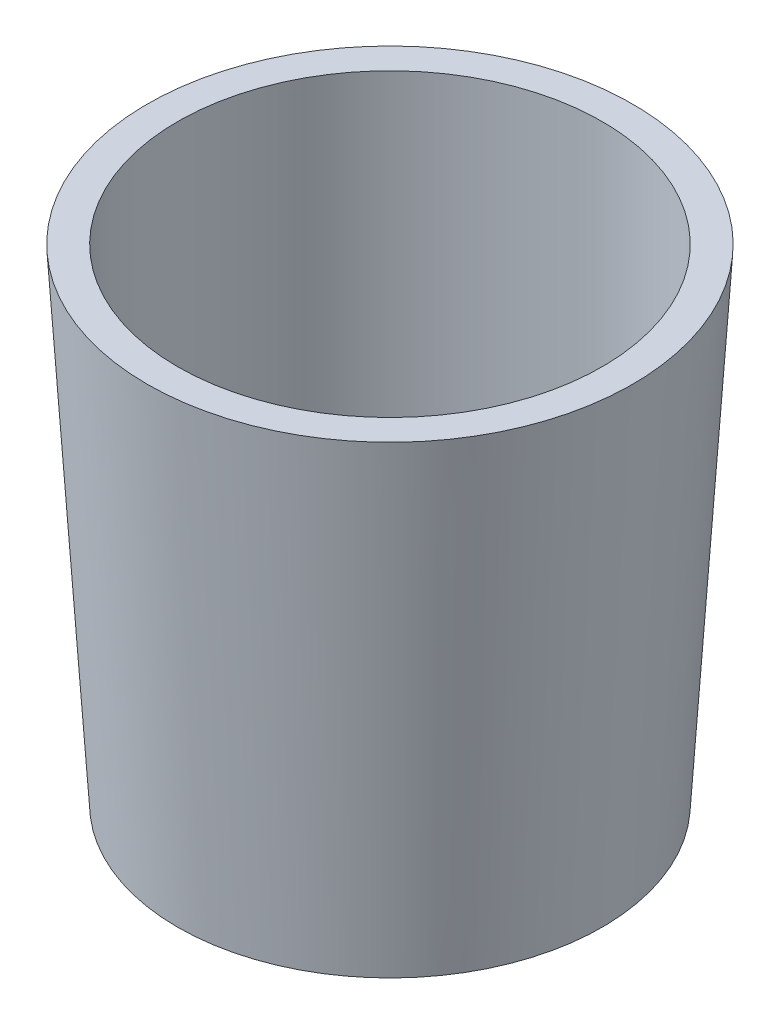
ISO-10303-21;
HEADER;
FILE_DESCRIPTION(('STEP AP214'),'2;1');
FILE_NAME('part.step','',(''),(''),'','','');
FILE_SCHEMA(('AUTOMOTIVE_DESIGN { 1 0 10303 214 1 1 1 1 }'));
ENDSEC;
DATA;
#1=APPLICATION_CONTEXT('core data for automotive mechanical design processes');
#2=APPLICATION_PROTOCOL_DEFINITION('international standard','automotive_design',2000,#1);
#3=PRODUCT_CONTEXT('',#1,'mechanical');
#4=PRODUCT('Part','Part','',(#3));
#5=PRODUCT_RELATED_PRODUCT_CATEGORY('part','',(#4));
#6=PRODUCT_DEFINITION_FORMATION('','',#4);
#7=PRODUCT_DEFINITION_CONTEXT('part definition',#1,'design');
#8=PRODUCT_DEFINITION('design','',#6,#7);
#9=PRODUCT_DEFINITION_SHAPE('','',#8);
#10=(LENGTH_UNIT() NAMED_UNIT(*) SI_UNIT(.MILLI.,.METRE.));
#11=(NAMED_UNIT(*) PLANE_ANGLE_UNIT() SI_UNIT($,.RADIAN.));
#12=(NAMED_UNIT(*) SI_UNIT($,.STERADIAN.) SOLID_ANGLE_UNIT());
#13=UNCERTAINTY_MEASURE_WITH_UNIT(LENGTH_MEASURE(1.E-05),#10,'distance_accuracy_value','');
#14=(GEOMETRIC_REPRESENTATION_CONTEXT(3) GLOBAL_UNCERTAINTY_ASSIGNED_CONTEXT((#13)) GLOBAL_UNIT_ASSIGNED_CONTEXT((#10,
#11,#12)) REPRESENTATION_CONTEXT('',''));
#15=CARTESIAN_POINT('',(0.,0.,0.));
#16=DIRECTION('',(0.,0.,1.));
#17=DIRECTION('',(1.,0.,0.));
#18=AXIS2_PLACEMENT_3D('',#15,#16,#17);
#19=CARTESIAN_POINT('',(0.,0.,0.));
#20=DIRECTION('',(0.,1.,0.));
#21=DIRECTION('',(0.,0.,1.));
#22=AXIS2_PLACEMENT_3D('',#19,#20,#21);
#23=PLANE('',#22);
#24=CARTESIAN_POINT('',(0.,0.,0.));
#25=DIRECTION('',(0.,1.,0.));
#26=DIRECTION('',(0.,0.,1.));
#27=AXIS2_PLACEMENT_3D('',#24,#25,#26);
#28=CIRCLE('',#27,35.);
#29=CARTESIAN_POINT('',(0.,0.,35.));
#30=VERTEX_POINT('',#29);
#31=EDGE_CURVE('E13',#30,#30,#28,.T.);
#32=ORIENTED_EDGE('',*,*,#31,.F.);
#33=EDGE_LOOP('',(#32));
#34=FACE_BOUND('',#33,.T.);
#35=ADVANCED_FACE('F53',(#34),#23,.F.);
#36=CARTESIAN_POINT('',(0.,80.,0.));
#37=DIRECTION('',(0.,1.,0.));
#38=DIRECTION('',(0.,0.,1.));
#39=AXIS2_PLACEMENT_3D('',#36,#37,#38);
#40=PLANE('',#39);
#41=CARTESIAN_POINT('',(0.,80.,0.));
#42=DIRECTION('',(0.,1.,0.));
#43=DIRECTION('',(0.,0.,1.));
#44=AXIS2_PLACEMENT_3D('',#41,#42,#43);
#45=CIRCLE('',#44,35.);
#46=CARTESIAN_POINT('',(0.,80.,35.));
#47=VERTEX_POINT('',#46);
#48=EDGE_CURVE('E121',#47,#47,#45,.T.);
#49=ORIENTED_EDGE('',*,*,#48,.F.);
#50=EDGE_LOOP('',(#49));
#51=FACE_BOUND('',#50,.T.);
#52=CARTESIAN_POINT('',(0.,80.,0.));
#53=DIRECTION('',(0.,1.,0.));
#54=DIRECTION('',(0.,0.,1.));
#55=AXIS2_PLACEMENT_3D('',#52,#53,#54);
#56=CIRCLE('',#55,40.);
#57=CARTESIAN_POINT('',(0.,80.,40.));
#58=VERTEX_POINT('',#57);
#59=EDGE_CURVE('E61',#58,#58,#56,.T.);
#60=ORIENTED_EDGE('',*,*,#59,.T.);
#61=EDGE_LOOP('',(#60));
#62=FACE_BOUND('',#61,.T.);
#63=ADVANCED_FACE('F86',(#51,#62),#40,.T.);
#64=CARTESIAN_POINT('',(0.,0.,0.));
#65=DIRECTION('',(0.,1.,0.));
#66=DIRECTION('',(0.,0.,1.));
#67=AXIS2_PLACEMENT_3D('',#64,#65,#66);
#68=CONICAL_SURFACE('',#67,35.,0.0624188099959573);
#69=ORIENTED_EDGE('',*,*,#59,.F.);
#70=EDGE_LOOP('',(#69));
#71=FACE_BOUND('',#70,.T.);
#72=ORIENTED_EDGE('',*,*,#31,.T.);
#73=EDGE_LOOP('',(#72));
#74=FACE_BOUND('',#73,.T.);
#75=ADVANCED_FACE('F95',(#71,#74),#68,.T.);
#76=CARTESIAN_POINT('',(0.,5.,0.));
#77=DIRECTION('',(0.,1.,0.));
#78=DIRECTION('',(0.,0.,1.));
#79=AXIS2_PLACEMENT_3D('',#76,#77,#78);
#80=CYLINDRICAL_SURFACE('',#79,35.);
#81=CARTESIAN_POINT('',(0.,5.,0.));
#82=DIRECTION('',(0.,1.,0.));
#83=DIRECTION('',(0.,0.,1.));
#84=AXIS2_PLACEMENT_3D('',#81,#82,#83);
#85=CIRCLE('',#84,35.);
#86=CARTESIAN_POINT('',(0.,5.,35.));
#87=VERTEX_POINT('',#86);
#88=EDGE_CURVE('E66',#87,#87,#85,.T.);
#89=ORIENTED_EDGE('',*,*,#88,.F.);
#90=EDGE_LOOP('',(#89));
#91=FACE_BOUND('',#90,.T.);
#92=ORIENTED_EDGE('',*,*,#48,.T.);
#93=EDGE_LOOP('',(#92));
#94=FACE_BOUND('',#93,.T.);
#95=ADVANCED_FACE('F97',(#91,#94),#80,.F.);
#96=CARTESIAN_POINT('',(0.,5.,0.));
#97=DIRECTION('',(0.,1.,0.));
#98=DIRECTION('',(0.,0.,1.));
#99=AXIS2_PLACEMENT_3D('',#96,#97,#98);
#100=PLANE('',#99);
#101=ORIENTED_EDGE('',*,*,#88,.T.);
#102=EDGE_LOOP('',(#101));
#103=FACE_BOUND('',#102,.T.);
#104=ADVANCED_FACE('F127',(#103),#100,.T.);
#105=CLOSED_SHELL('',(#35,#63,#75,#95,#104));
#106=MANIFOLD_SOLID_BREP('B2',#105);
#107=ADVANCED_BREP_SHAPE_REPRESENTATION('',(#18,#106),#14);
#108=SHAPE_DEFINITION_REPRESENTATION(#9,#107);
ENDSEC;
END-ISO-10303-21;
